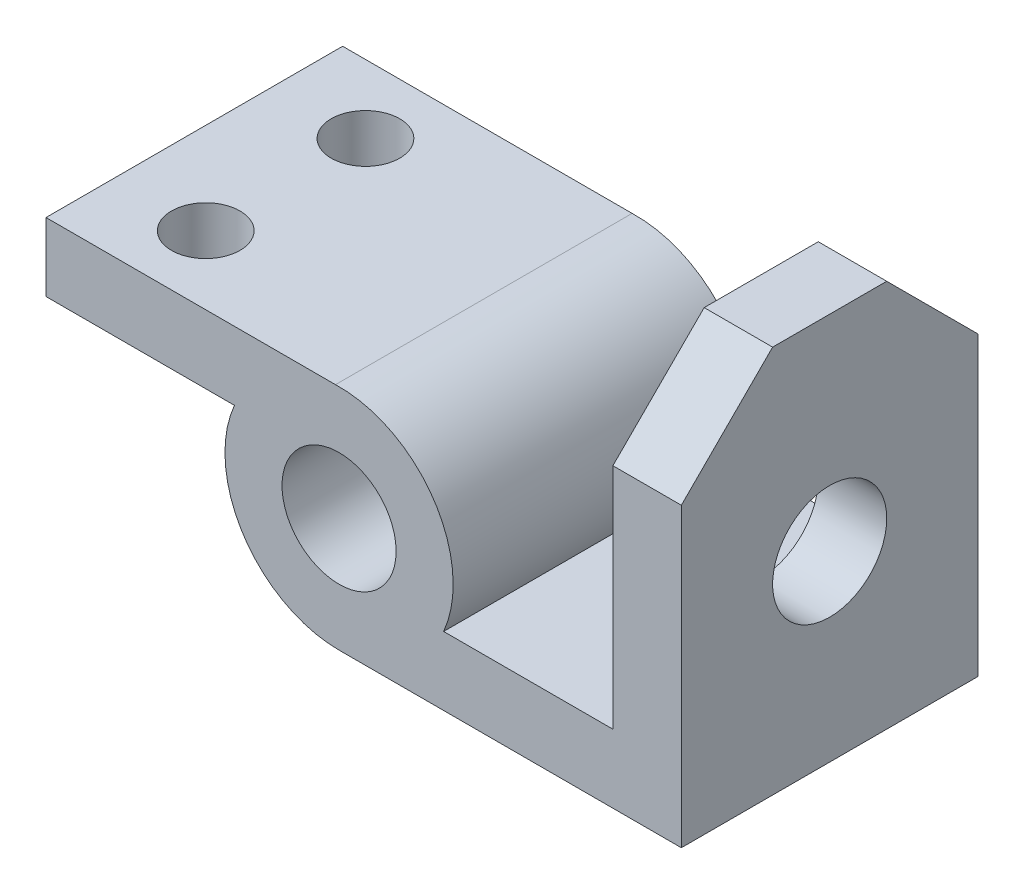
ISO-10303-21;
HEADER;
FILE_DESCRIPTION(('STEP AP214'),'2;1');
FILE_NAME('part.step','',(''),(''),'','','');
FILE_SCHEMA(('AUTOMOTIVE_DESIGN { 1 0 10303 214 1 1 1 1 }'));
ENDSEC;
DATA;
#1=APPLICATION_CONTEXT('core data for automotive mechanical design processes');
#2=APPLICATION_PROTOCOL_DEFINITION('international standard','automotive_design',2000,#1);
#3=PRODUCT_CONTEXT('',#1,'mechanical');
#4=PRODUCT('Part','Part','',(#3));
#5=PRODUCT_RELATED_PRODUCT_CATEGORY('part','',(#4));
#6=PRODUCT_DEFINITION_FORMATION('','',#4);
#7=PRODUCT_DEFINITION_CONTEXT('part definition',#1,'design');
#8=PRODUCT_DEFINITION('design','',#6,#7);
#9=PRODUCT_DEFINITION_SHAPE('','',#8);
#10=(LENGTH_UNIT() NAMED_UNIT(*) SI_UNIT(.MILLI.,.METRE.));
#11=(NAMED_UNIT(*) PLANE_ANGLE_UNIT() SI_UNIT($,.RADIAN.));
#12=(NAMED_UNIT(*) SI_UNIT($,.STERADIAN.) SOLID_ANGLE_UNIT());
#13=UNCERTAINTY_MEASURE_WITH_UNIT(LENGTH_MEASURE(1.E-05),#10,'distance_accuracy_value','');
#14=(GEOMETRIC_REPRESENTATION_CONTEXT(3) GLOBAL_UNCERTAINTY_ASSIGNED_CONTEXT((#13)) GLOBAL_UNIT_ASSIGNED_CONTEXT((#10,
#11,#12)) REPRESENTATION_CONTEXT('',''));
#15=CARTESIAN_POINT('',(0.,0.,0.));
#16=DIRECTION('',(0.,0.,1.));
#17=DIRECTION('',(1.,0.,0.));
#18=AXIS2_PLACEMENT_3D('',#15,#16,#17);
#19=CARTESIAN_POINT('',(95.25,-12.7,-82.55));
#20=DIRECTION('',(0.,1.,0.));
#21=DIRECTION('',(-1.,0.,0.));
#22=AXIS2_PLACEMENT_3D('',#19,#20,#21);
#23=PLANE('',#22);
#24=DIRECTION('',(-1.,0.,0.));
#25=VECTOR('',#24,1.);
#26=CARTESIAN_POINT('',(95.25,-12.7,0.));
#27=LINE('',#26,#25);
#28=CARTESIAN_POINT('',(76.2,-12.7,0.));
#29=VERTEX_POINT('',#28);
#30=CARTESIAN_POINT('',(29.0993556629696,-12.7,0.));
#31=VERTEX_POINT('',#30);
#32=EDGE_CURVE('E156',#29,#31,#27,.T.);
#33=ORIENTED_EDGE('',*,*,#32,.F.);
#34=DIRECTION('',(0.,0.,1.));
#35=VECTOR('',#34,1.);
#36=CARTESIAN_POINT('',(76.2,-12.7,-82.55));
#37=LINE('',#36,#35);
#38=CARTESIAN_POINT('',(76.2,-12.7,-82.55));
#39=VERTEX_POINT('',#38);
#40=EDGE_CURVE('E144',#39,#29,#37,.T.);
#41=ORIENTED_EDGE('',*,*,#40,.F.);
#42=DIRECTION('',(-1.,0.,0.));
#43=VECTOR('',#42,1.);
#44=CARTESIAN_POINT('',(95.25,-12.7,-82.55));
#45=LINE('',#44,#43);
#46=CARTESIAN_POINT('',(29.0993556629696,-12.7,-82.55));
#47=VERTEX_POINT('',#46);
#48=EDGE_CURVE('E154',#39,#47,#45,.T.);
#49=ORIENTED_EDGE('',*,*,#48,.T.);
#50=DIRECTION('',(0.,0.,1.));
#51=VECTOR('',#50,1.);
#52=CARTESIAN_POINT('',(29.0993556629696,-12.7,-82.55));
#53=LINE('',#52,#51);
#54=EDGE_CURVE('E327',#47,#31,#53,.T.);
#55=ORIENTED_EDGE('',*,*,#54,.T.);
#56=EDGE_LOOP('',(#33,#41,#49,#55));
#57=FACE_BOUND('',#56,.T.);
#58=ADVANCED_FACE('F47',(#57),#23,.T.);
#59=CARTESIAN_POINT('',(0.,0.,-82.55));
#60=DIRECTION('',(0.,0.,1.));
#61=DIRECTION('',(1.,0.,0.));
#62=AXIS2_PLACEMENT_3D('',#59,#60,#61);
#63=CYLINDRICAL_SURFACE('',#62,31.75);
#64=ORIENTED_EDGE('',*,*,#54,.F.);
#65=CARTESIAN_POINT('',(0.,0.,-82.55));
#66=DIRECTION('',(0.,0.,1.));
#67=DIRECTION('',(1.,0.,0.));
#68=AXIS2_PLACEMENT_3D('',#65,#66,#67);
#69=CIRCLE('',#68,31.75);
#70=CARTESIAN_POINT('',(-0.997093543872898,31.7343395151808,-82.55));
#71=VERTEX_POINT('',#70);
#72=EDGE_CURVE('E165',#47,#71,#69,.T.);
#73=ORIENTED_EDGE('',*,*,#72,.T.);
#74=DIRECTION('',(0.,0.,1.));
#75=VECTOR('',#74,1.);
#76=CARTESIAN_POINT('',(-0.997093543872898,31.7343395151808,-82.55));
#77=LINE('',#76,#75);
#78=CARTESIAN_POINT('',(-0.997093543872898,31.7343395151808,0.));
#79=VERTEX_POINT('',#78);
#80=EDGE_CURVE('E211',#79,#71,#77,.F.);
#81=ORIENTED_EDGE('',*,*,#80,.F.);
#82=CARTESIAN_POINT('',(0.,0.,0.));
#83=DIRECTION('',(0.,0.,1.));
#84=DIRECTION('',(1.,0.,0.));
#85=AXIS2_PLACEMENT_3D('',#82,#83,#84);
#86=CIRCLE('',#85,31.75);
#87=EDGE_CURVE('E226',#31,#79,#86,.T.);
#88=ORIENTED_EDGE('',*,*,#87,.F.);
#89=EDGE_LOOP('',(#64,#73,#81,#88));
#90=FACE_BOUND('',#89,.T.);
#91=ADVANCED_FACE('F279',(#90),#63,.T.);
#92=DIRECTION('',(0.,0.,1.));
#93=VECTOR('',#92,1.);
#94=CARTESIAN_POINT('',(0.,-31.75,-82.55));
#95=LINE('',#94,#93);
#96=CARTESIAN_POINT('',(0.,-31.75,-82.55));
#97=VERTEX_POINT('',#96);
#98=CARTESIAN_POINT('',(0.,-31.75,0.));
#99=VERTEX_POINT('',#98);
#100=EDGE_CURVE('E168',#97,#99,#95,.T.);
#101=ORIENTED_EDGE('',*,*,#100,.T.);
#102=CARTESIAN_POINT('',(-29.1061854433662,12.6843395151808,0.));
#103=VERTEX_POINT('',#102);
#104=EDGE_CURVE('E235',#103,#99,#86,.T.);
#105=ORIENTED_EDGE('',*,*,#104,.F.);
#106=DIRECTION('',(0.,0.,1.));
#107=VECTOR('',#106,1.);
#108=CARTESIAN_POINT('',(-29.1061854433662,12.6843395151808,-82.55));
#109=LINE('',#108,#107);
#110=CARTESIAN_POINT('',(-29.1061854433662,12.6843395151808,-82.55));
#111=VERTEX_POINT('',#110);
#112=EDGE_CURVE('E207',#111,#103,#109,.T.);
#113=ORIENTED_EDGE('',*,*,#112,.F.);
#114=EDGE_CURVE('E230',#111,#97,#69,.T.);
#115=ORIENTED_EDGE('',*,*,#114,.T.);
#116=EDGE_LOOP('',(#101,#105,#113,#115));
#117=FACE_BOUND('',#116,.T.);
#118=ADVANCED_FACE('F286',(#117),#63,.T.);
#119=CARTESIAN_POINT('',(0.,0.,-82.55));
#120=DIRECTION('',(0.,0.,1.));
#121=DIRECTION('',(1.,0.,0.));
#122=AXIS2_PLACEMENT_3D('',#119,#120,#121);
#123=PLANE('',#122);
#124=DIRECTION('',(0.,-1.,0.));
#125=VECTOR('',#124,1.);
#126=CARTESIAN_POINT('',(76.2,76.2,-82.55));
#127=LINE('',#126,#125);
#128=CARTESIAN_POINT('',(76.2,50.7999999999999,-82.55));
#129=VERTEX_POINT('',#128);
#130=EDGE_CURVE('E139',#129,#39,#127,.T.);
#131=ORIENTED_EDGE('',*,*,#130,.F.);
#132=DIRECTION('',(1.,0.,0.));
#133=VECTOR('',#132,1.);
#134=CARTESIAN_POINT('',(0.,50.7999999999999,-82.55));
#135=LINE('',#134,#133);
#136=CARTESIAN_POINT('',(95.25,50.7999999999998,-82.55));
#137=VERTEX_POINT('',#136);
#138=EDGE_CURVE('E72',#129,#137,#135,.T.);
#139=ORIENTED_EDGE('',*,*,#138,.T.);
#140=DIRECTION('',(0.,1.,0.));
#141=VECTOR('',#140,1.);
#142=CARTESIAN_POINT('',(95.25,-31.75,-82.55));
#143=LINE('',#142,#141);
#144=CARTESIAN_POINT('',(95.25,-31.75,-82.55));
#145=VERTEX_POINT('',#144);
#146=EDGE_CURVE('E167',#145,#137,#143,.T.);
#147=ORIENTED_EDGE('',*,*,#146,.F.);
#148=DIRECTION('',(1.,0.,0.));
#149=VECTOR('',#148,1.);
#150=CARTESIAN_POINT('',(0.,-31.75,-82.55));
#151=LINE('',#150,#149);
#152=EDGE_CURVE('E172',#97,#145,#151,.T.);
#153=ORIENTED_EDGE('',*,*,#152,.F.);
#154=ORIENTED_EDGE('',*,*,#114,.F.);
#155=DIRECTION('',(1.,0.,0.));
#156=VECTOR('',#155,1.);
#157=CARTESIAN_POINT('',(-29.1061854433662,12.6843395151808,-82.55));
#158=LINE('',#157,#156);
#159=CARTESIAN_POINT('',(-81.5529064561271,12.6843395151808,-82.55));
#160=VERTEX_POINT('',#159);
#161=EDGE_CURVE('E192',#160,#111,#158,.T.);
#162=ORIENTED_EDGE('',*,*,#161,.F.);
#163=DIRECTION('',(0.,-1.,0.));
#164=VECTOR('',#163,1.);
#165=CARTESIAN_POINT('',(-81.5529064561271,31.7343395151808,-82.55));
#166=LINE('',#165,#164);
#167=CARTESIAN_POINT('',(-81.5529064561271,31.7343395151808,-82.55));
#168=VERTEX_POINT('',#167);
#169=EDGE_CURVE('E187',#168,#160,#166,.T.);
#170=ORIENTED_EDGE('',*,*,#169,.F.);
#171=DIRECTION('',(-1.,0.,0.));
#172=VECTOR('',#171,1.);
#173=CARTESIAN_POINT('',(0.997093543872919,31.7343395151808,-82.55));
#174=LINE('',#173,#172);
#175=EDGE_CURVE('E184',#71,#168,#174,.T.);
#176=ORIENTED_EDGE('',*,*,#175,.F.);
#177=ORIENTED_EDGE('',*,*,#72,.F.);
#178=ORIENTED_EDGE('',*,*,#48,.F.);
#179=EDGE_LOOP('',(#131,#139,#147,#153,#154,#162,#170,#176,#177,#178));
#180=FACE_BOUND('',#179,.T.);
#181=CARTESIAN_POINT('',(0.,0.,-82.55));
#182=DIRECTION('',(0.,0.,1.));
#183=DIRECTION('',(1.,0.,0.));
#184=AXIS2_PLACEMENT_3D('',#181,#182,#183);
#185=CIRCLE('',#184,15.875);
#186=CARTESIAN_POINT('',(15.875,0.,-82.55));
#187=VERTEX_POINT('',#186);
#188=EDGE_CURVE('E222',#187,#187,#185,.T.);
#189=ORIENTED_EDGE('',*,*,#188,.T.);
#190=EDGE_LOOP('',(#189));
#191=FACE_BOUND('',#190,.T.);
#192=ADVANCED_FACE('F162',(#180,#191),#123,.F.);
#193=CARTESIAN_POINT('',(0.,0.,0.));
#194=DIRECTION('',(0.,0.,1.));
#195=DIRECTION('',(1.,0.,0.));
#196=AXIS2_PLACEMENT_3D('',#193,#194,#195);
#197=PLANE('',#196);
#198=DIRECTION('',(0.,1.,0.));
#199=VECTOR('',#198,1.);
#200=CARTESIAN_POINT('',(95.25,-31.75,0.));
#201=LINE('',#200,#199);
#202=CARTESIAN_POINT('',(95.25,-31.75,0.));
#203=VERTEX_POINT('',#202);
#204=CARTESIAN_POINT('',(95.25,50.7999999999999,0.));
#205=VERTEX_POINT('',#204);
#206=EDGE_CURVE('E329',#203,#205,#201,.T.);
#207=ORIENTED_EDGE('',*,*,#206,.T.);
#208=DIRECTION('',(-1.,0.,0.));
#209=VECTOR('',#208,1.);
#210=CARTESIAN_POINT('',(76.2,50.7999999999999,0.));
#211=LINE('',#210,#209);
#212=CARTESIAN_POINT('',(76.2,50.7999999999999,0.));
#213=VERTEX_POINT('',#212);
#214=EDGE_CURVE('E11',#205,#213,#211,.T.);
#215=ORIENTED_EDGE('',*,*,#214,.T.);
#216=DIRECTION('',(0.,-1.,0.));
#217=VECTOR('',#216,1.);
#218=CARTESIAN_POINT('',(76.2,76.2,0.));
#219=LINE('',#218,#217);
#220=EDGE_CURVE('E150',#213,#29,#219,.T.);
#221=ORIENTED_EDGE('',*,*,#220,.T.);
#222=ORIENTED_EDGE('',*,*,#32,.T.);
#223=ORIENTED_EDGE('',*,*,#87,.T.);
#224=DIRECTION('',(-1.,0.,0.));
#225=VECTOR('',#224,1.);
#226=CARTESIAN_POINT('',(0.997093543872919,31.7343395151808,0.));
#227=LINE('',#226,#225);
#228=CARTESIAN_POINT('',(-81.5529064561271,31.7343395151808,0.));
#229=VERTEX_POINT('',#228);
#230=EDGE_CURVE('E197',#79,#229,#227,.T.);
#231=ORIENTED_EDGE('',*,*,#230,.T.);
#232=DIRECTION('',(0.,-1.,0.));
#233=VECTOR('',#232,1.);
#234=CARTESIAN_POINT('',(-81.5529064561271,31.7343395151808,0.));
#235=LINE('',#234,#233);
#236=CARTESIAN_POINT('',(-81.5529064561271,12.6843395151808,0.));
#237=VERTEX_POINT('',#236);
#238=EDGE_CURVE('E200',#229,#237,#235,.T.);
#239=ORIENTED_EDGE('',*,*,#238,.T.);
#240=DIRECTION('',(1.,0.,0.));
#241=VECTOR('',#240,1.);
#242=CARTESIAN_POINT('',(-29.1061854433662,12.6843395151808,0.));
#243=LINE('',#242,#241);
#244=EDGE_CURVE('E188',#237,#103,#243,.T.);
#245=ORIENTED_EDGE('',*,*,#244,.T.);
#246=ORIENTED_EDGE('',*,*,#104,.T.);
#247=DIRECTION('',(1.,0.,0.));
#248=VECTOR('',#247,1.);
#249=CARTESIAN_POINT('',(0.,-31.75,0.));
#250=LINE('',#249,#248);
#251=EDGE_CURVE('E178',#99,#203,#250,.T.);
#252=ORIENTED_EDGE('',*,*,#251,.T.);
#253=EDGE_LOOP('',(#207,#215,#221,#222,#223,#231,#239,#245,#246,#252));
#254=FACE_BOUND('',#253,.T.);
#255=CARTESIAN_POINT('',(0.,0.,0.));
#256=DIRECTION('',(0.,0.,1.));
#257=DIRECTION('',(1.,0.,0.));
#258=AXIS2_PLACEMENT_3D('',#255,#256,#257);
#259=CIRCLE('',#258,15.875);
#260=CARTESIAN_POINT('',(15.875,0.,0.));
#261=VERTEX_POINT('',#260);
#262=EDGE_CURVE('E221',#261,#261,#259,.T.);
#263=ORIENTED_EDGE('',*,*,#262,.F.);
#264=EDGE_LOOP('',(#263));
#265=FACE_BOUND('',#264,.T.);
#266=ADVANCED_FACE('F306',(#254,#265),#197,.T.);
#267=CARTESIAN_POINT('',(0.,0.,-82.55));
#268=DIRECTION('',(0.,0.,1.));
#269=DIRECTION('',(1.,0.,0.));
#270=AXIS2_PLACEMENT_3D('',#267,#268,#269);
#271=CYLINDRICAL_SURFACE('',#270,15.875);
#272=ORIENTED_EDGE('',*,*,#188,.F.);
#273=EDGE_LOOP('',(#272));
#274=FACE_BOUND('',#273,.T.);
#275=ORIENTED_EDGE('',*,*,#262,.T.);
#276=EDGE_LOOP('',(#275));
#277=FACE_BOUND('',#276,.T.);
#278=ADVANCED_FACE('F295',(#274,#277),#271,.F.);
#279=CARTESIAN_POINT('',(-29.1061854433662,12.6843395151808,-82.55));
#280=DIRECTION('',(0.,-1.,0.));
#281=DIRECTION('',(1.,0.,0.));
#282=AXIS2_PLACEMENT_3D('',#279,#280,#281);
#283=PLANE('',#282);
#284=CARTESIAN_POINT('',(-56.1529064561271,12.6843395151808,-63.5));
#285=DIRECTION('',(0.,-1.,0.));
#286=DIRECTION('',(1.,0.,0.));
#287=AXIS2_PLACEMENT_3D('',#284,#285,#286);
#288=CIRCLE('',#287,9.52500000000002);
#289=CARTESIAN_POINT('',(-46.6279064561271,12.6843395151808,-63.5));
#290=VERTEX_POINT('',#289);
#291=EDGE_CURVE('E337',#290,#290,#288,.T.);
#292=ORIENTED_EDGE('',*,*,#291,.F.);
#293=EDGE_LOOP('',(#292));
#294=FACE_BOUND('',#293,.T.);
#295=CARTESIAN_POINT('',(-56.1529064561271,12.6843395151808,-19.05));
#296=DIRECTION('',(0.,-1.,0.));
#297=DIRECTION('',(1.,0.,0.));
#298=AXIS2_PLACEMENT_3D('',#295,#296,#297);
#299=CIRCLE('',#298,9.525);
#300=CARTESIAN_POINT('',(-46.6279064561271,12.6843395151808,-19.05));
#301=VERTEX_POINT('',#300);
#302=EDGE_CURVE('E342',#301,#301,#299,.T.);
#303=ORIENTED_EDGE('',*,*,#302,.F.);
#304=EDGE_LOOP('',(#303));
#305=FACE_BOUND('',#304,.T.);
#306=ORIENTED_EDGE('',*,*,#244,.F.);
#307=DIRECTION('',(0.,0.,1.));
#308=VECTOR('',#307,1.);
#309=CARTESIAN_POINT('',(-81.5529064561271,12.6843395151808,-82.55));
#310=LINE('',#309,#308);
#311=EDGE_CURVE('E212',#160,#237,#310,.T.);
#312=ORIENTED_EDGE('',*,*,#311,.F.);
#313=ORIENTED_EDGE('',*,*,#161,.T.);
#314=ORIENTED_EDGE('',*,*,#112,.T.);
#315=EDGE_LOOP('',(#306,#312,#313,#314));
#316=FACE_BOUND('',#315,.T.);
#317=ADVANCED_FACE('F291',(#294,#305,#316),#283,.T.);
#318=CARTESIAN_POINT('',(-81.5529064561271,31.7343395151808,-82.55));
#319=DIRECTION('',(-1.,0.,0.));
#320=DIRECTION('',(0.,0.,1.));
#321=AXIS2_PLACEMENT_3D('',#318,#319,#320);
#322=PLANE('',#321);
#323=ORIENTED_EDGE('',*,*,#238,.F.);
#324=DIRECTION('',(0.,0.,1.));
#325=VECTOR('',#324,1.);
#326=CARTESIAN_POINT('',(-81.5529064561271,31.7343395151808,-82.55));
#327=LINE('',#326,#325);
#328=EDGE_CURVE('E196',#168,#229,#327,.T.);
#329=ORIENTED_EDGE('',*,*,#328,.F.);
#330=ORIENTED_EDGE('',*,*,#169,.T.);
#331=ORIENTED_EDGE('',*,*,#311,.T.);
#332=EDGE_LOOP('',(#323,#329,#330,#331));
#333=FACE_BOUND('',#332,.T.);
#334=ADVANCED_FACE('F294',(#333),#322,.T.);
#335=CARTESIAN_POINT('',(0.997093543872919,31.7343395151808,-82.55));
#336=DIRECTION('',(0.,1.,0.));
#337=DIRECTION('',(-1.,0.,0.));
#338=AXIS2_PLACEMENT_3D('',#335,#336,#337);
#339=PLANE('',#338);
#340=CARTESIAN_POINT('',(-56.1529064561271,31.7343395151808,-63.5));
#341=DIRECTION('',(0.,1.,0.));
#342=DIRECTION('',(-1.,0.,0.));
#343=AXIS2_PLACEMENT_3D('',#340,#341,#342);
#344=CIRCLE('',#343,9.52500000000002);
#345=CARTESIAN_POINT('',(-65.6779064561271,31.7343395151808,-63.5));
#346=VERTEX_POINT('',#345);
#347=EDGE_CURVE('E346',#346,#346,#344,.T.);
#348=ORIENTED_EDGE('',*,*,#347,.F.);
#349=EDGE_LOOP('',(#348));
#350=FACE_BOUND('',#349,.T.);
#351=CARTESIAN_POINT('',(-56.1529064561271,31.7343395151808,-19.05));
#352=DIRECTION('',(0.,1.,0.));
#353=DIRECTION('',(-1.,0.,0.));
#354=AXIS2_PLACEMENT_3D('',#351,#352,#353);
#355=CIRCLE('',#354,9.525);
#356=CARTESIAN_POINT('',(-65.6779064561271,31.7343395151808,-19.05));
#357=VERTEX_POINT('',#356);
#358=EDGE_CURVE('E149',#357,#357,#355,.T.);
#359=ORIENTED_EDGE('',*,*,#358,.F.);
#360=EDGE_LOOP('',(#359));
#361=FACE_BOUND('',#360,.T.);
#362=ORIENTED_EDGE('',*,*,#230,.F.);
#363=ORIENTED_EDGE('',*,*,#80,.T.);
#364=ORIENTED_EDGE('',*,*,#175,.T.);
#365=ORIENTED_EDGE('',*,*,#328,.T.);
#366=EDGE_LOOP('',(#362,#363,#364,#365));
#367=FACE_BOUND('',#366,.T.);
#368=ADVANCED_FACE('F299',(#350,#361,#367),#339,.T.);
#369=CARTESIAN_POINT('',(95.25,-31.75,-82.55));
#370=DIRECTION('',(1.,0.,0.));
#371=DIRECTION('',(0.,0.,-1.));
#372=AXIS2_PLACEMENT_3D('',#369,#370,#371);
#373=PLANE('',#372);
#374=CARTESIAN_POINT('',(95.25,19.05,-41.275));
#375=DIRECTION('',(1.,0.,0.));
#376=DIRECTION('',(0.,0.,-1.));
#377=AXIS2_PLACEMENT_3D('',#374,#375,#376);
#378=CIRCLE('',#377,15.875);
#379=CARTESIAN_POINT('',(95.25,19.05,-57.15));
#380=VERTEX_POINT('',#379);
#381=EDGE_CURVE('E357',#380,#380,#378,.T.);
#382=ORIENTED_EDGE('',*,*,#381,.F.);
#383=EDGE_LOOP('',(#382));
#384=FACE_BOUND('',#383,.T.);
#385=ORIENTED_EDGE('',*,*,#146,.T.);
#386=DIRECTION('',(0.,-0.707106781186548,-0.707106781186548));
#387=VECTOR('',#386,1.);
#388=CARTESIAN_POINT('',(95.25,9.52499999999993,-123.825));
#389=LINE('',#388,#387);
#390=CARTESIAN_POINT('',(95.25,76.2,-57.1499999999999));
#391=VERTEX_POINT('',#390);
#392=EDGE_CURVE('E57',#137,#391,#389,.F.);
#393=ORIENTED_EDGE('',*,*,#392,.T.);
#394=DIRECTION('',(0.,0.,-1.));
#395=VECTOR('',#394,1.);
#396=CARTESIAN_POINT('',(95.25,76.2,-82.55));
#397=LINE('',#396,#395);
#398=CARTESIAN_POINT('',(95.25,76.2,-25.4000000000001));
#399=VERTEX_POINT('',#398);
#400=EDGE_CURVE('E158',#399,#391,#397,.T.);
#401=ORIENTED_EDGE('',*,*,#400,.F.);
#402=DIRECTION('',(0.,-0.707106781186548,0.707106781186548));
#403=VECTOR('',#402,1.);
#404=CARTESIAN_POINT('',(95.25,50.7999999999999,0.));
#405=LINE('',#404,#403);
#406=EDGE_CURVE('E64',#399,#205,#405,.T.);
#407=ORIENTED_EDGE('',*,*,#406,.T.);
#408=ORIENTED_EDGE('',*,*,#206,.F.);
#409=DIRECTION('',(0.,0.,1.));
#410=VECTOR('',#409,1.);
#411=CARTESIAN_POINT('',(95.25,-31.75,-82.55));
#412=LINE('',#411,#410);
#413=EDGE_CURVE('E175',#145,#203,#412,.T.);
#414=ORIENTED_EDGE('',*,*,#413,.F.);
#415=EDGE_LOOP('',(#385,#393,#401,#407,#408,#414));
#416=FACE_BOUND('',#415,.T.);
#417=ADVANCED_FACE('F257',(#384,#416),#373,.T.);
#418=CARTESIAN_POINT('',(0.,-31.75,-82.55));
#419=DIRECTION('',(0.,-1.,0.));
#420=DIRECTION('',(0.,0.,-1.));
#421=AXIS2_PLACEMENT_3D('',#418,#419,#420);
#422=PLANE('',#421);
#423=ORIENTED_EDGE('',*,*,#251,.F.);
#424=ORIENTED_EDGE('',*,*,#100,.F.);
#425=ORIENTED_EDGE('',*,*,#152,.T.);
#426=ORIENTED_EDGE('',*,*,#413,.T.);
#427=EDGE_LOOP('',(#423,#424,#425,#426));
#428=FACE_BOUND('',#427,.T.);
#429=ADVANCED_FACE('F325',(#428),#422,.T.);
#430=CARTESIAN_POINT('',(-56.1529064561271,-50.8156604848192,-19.05));
#431=DIRECTION('',(0.,1.,0.));
#432=DIRECTION('',(-1.,0.,0.));
#433=AXIS2_PLACEMENT_3D('',#430,#431,#432);
#434=CYLINDRICAL_SURFACE('',#433,9.525);
#435=ORIENTED_EDGE('',*,*,#302,.T.);
#436=EDGE_LOOP('',(#435));
#437=FACE_BOUND('',#436,.T.);
#438=ORIENTED_EDGE('',*,*,#358,.T.);
#439=EDGE_LOOP('',(#438));
#440=FACE_BOUND('',#439,.T.);
#441=ADVANCED_FACE('F373',(#437,#440),#434,.F.);
#442=CARTESIAN_POINT('',(-56.1529064561271,-50.8156604848192,-63.5));
#443=DIRECTION('',(0.,1.,0.));
#444=DIRECTION('',(-1.,0.,0.));
#445=AXIS2_PLACEMENT_3D('',#442,#443,#444);
#446=CYLINDRICAL_SURFACE('',#445,9.52500000000002);
#447=ORIENTED_EDGE('',*,*,#291,.T.);
#448=EDGE_LOOP('',(#447));
#449=FACE_BOUND('',#448,.T.);
#450=ORIENTED_EDGE('',*,*,#347,.T.);
#451=EDGE_LOOP('',(#450));
#452=FACE_BOUND('',#451,.T.);
#453=ADVANCED_FACE('F367',(#449,#452),#446,.F.);
#454=CARTESIAN_POINT('',(76.2,76.2,-82.55));
#455=DIRECTION('',(1.,0.,0.));
#456=DIRECTION('',(0.,0.,-1.));
#457=AXIS2_PLACEMENT_3D('',#454,#455,#456);
#458=PLANE('',#457);
#459=CARTESIAN_POINT('',(76.2,19.05,-41.275));
#460=DIRECTION('',(1.,0.,0.));
#461=DIRECTION('',(0.,0.,-1.));
#462=AXIS2_PLACEMENT_3D('',#459,#460,#461);
#463=CIRCLE('',#462,15.875);
#464=CARTESIAN_POINT('',(76.2,19.05,-57.15));
#465=VERTEX_POINT('',#464);
#466=EDGE_CURVE('E159',#465,#465,#463,.F.);
#467=ORIENTED_EDGE('',*,*,#466,.F.);
#468=EDGE_LOOP('',(#467));
#469=FACE_BOUND('',#468,.T.);
#470=DIRECTION('',(0.,0.,1.));
#471=VECTOR('',#470,1.);
#472=CARTESIAN_POINT('',(76.2,76.2,-82.55));
#473=LINE('',#472,#471);
#474=CARTESIAN_POINT('',(76.2,76.2,-57.1499999999999));
#475=VERTEX_POINT('',#474);
#476=CARTESIAN_POINT('',(76.2,76.2,-25.4000000000001));
#477=VERTEX_POINT('',#476);
#478=EDGE_CURVE('E265',#475,#477,#473,.T.);
#479=ORIENTED_EDGE('',*,*,#478,.F.);
#480=DIRECTION('',(0.,0.707106781186548,0.707106781186548));
#481=VECTOR('',#480,1.);
#482=CARTESIAN_POINT('',(76.2,76.2,-57.1499999999999));
#483=LINE('',#482,#481);
#484=EDGE_CURVE('E146',#475,#129,#483,.F.);
#485=ORIENTED_EDGE('',*,*,#484,.T.);
#486=ORIENTED_EDGE('',*,*,#130,.T.);
#487=ORIENTED_EDGE('',*,*,#40,.T.);
#488=ORIENTED_EDGE('',*,*,#220,.F.);
#489=DIRECTION('',(0.,0.707106781186548,-0.707106781186548));
#490=VECTOR('',#489,1.);
#491=CARTESIAN_POINT('',(76.2,76.2,-25.4000000000001));
#492=LINE('',#491,#490);
#493=EDGE_CURVE('E246',#213,#477,#492,.T.);
#494=ORIENTED_EDGE('',*,*,#493,.T.);
#495=EDGE_LOOP('',(#479,#485,#486,#487,#488,#494));
#496=FACE_BOUND('',#495,.T.);
#497=ADVANCED_FACE('F142',(#469,#496),#458,.F.);
#498=CARTESIAN_POINT('',(0.,76.2,0.));
#499=DIRECTION('',(0.,-1.,0.));
#500=DIRECTION('',(1.,0.,0.));
#501=AXIS2_PLACEMENT_3D('',#498,#499,#500);
#502=PLANE('',#501);
#503=ORIENTED_EDGE('',*,*,#400,.T.);
#504=DIRECTION('',(-1.,0.,0.));
#505=VECTOR('',#504,1.);
#506=CARTESIAN_POINT('',(0.,76.2,-57.1499999999999));
#507=LINE('',#506,#505);
#508=EDGE_CURVE('E242',#391,#475,#507,.T.);
#509=ORIENTED_EDGE('',*,*,#508,.T.);
#510=ORIENTED_EDGE('',*,*,#478,.T.);
#511=DIRECTION('',(1.,0.,0.));
#512=VECTOR('',#511,1.);
#513=CARTESIAN_POINT('',(95.25,76.2,-25.4000000000001));
#514=LINE('',#513,#512);
#515=EDGE_CURVE('E234',#477,#399,#514,.T.);
#516=ORIENTED_EDGE('',*,*,#515,.T.);
#517=EDGE_LOOP('',(#503,#509,#510,#516));
#518=FACE_BOUND('',#517,.T.);
#519=ADVANCED_FACE('F261',(#518),#502,.F.);
#520=CARTESIAN_POINT('',(0.,76.2,-57.1499999999999));
#521=DIRECTION('',(0.,-0.707106781186548,0.707106781186548));
#522=DIRECTION('',(-1.,0.,0.));
#523=AXIS2_PLACEMENT_3D('',#520,#521,#522);
#524=PLANE('',#523);
#525=ORIENTED_EDGE('',*,*,#392,.F.);
#526=ORIENTED_EDGE('',*,*,#138,.F.);
#527=ORIENTED_EDGE('',*,*,#484,.F.);
#528=ORIENTED_EDGE('',*,*,#508,.F.);
#529=EDGE_LOOP('',(#525,#526,#527,#528));
#530=FACE_BOUND('',#529,.T.);
#531=ADVANCED_FACE('F267',(#530),#524,.F.);
#532=CARTESIAN_POINT('',(0.,76.2,-25.4000000000001));
#533=DIRECTION('',(0.,0.707106781186548,0.707106781186548));
#534=DIRECTION('',(-1.,0.,0.));
#535=AXIS2_PLACEMENT_3D('',#532,#533,#534);
#536=PLANE('',#535);
#537=ORIENTED_EDGE('',*,*,#493,.F.);
#538=ORIENTED_EDGE('',*,*,#214,.F.);
#539=ORIENTED_EDGE('',*,*,#406,.F.);
#540=ORIENTED_EDGE('',*,*,#515,.F.);
#541=EDGE_LOOP('',(#537,#538,#539,#540));
#542=FACE_BOUND('',#541,.T.);
#543=ADVANCED_FACE('F50',(#542),#536,.T.);
#544=CARTESIAN_POINT('',(-81.5539064561271,19.05,-41.275));
#545=DIRECTION('',(1.,0.,0.));
#546=DIRECTION('',(0.,0.,-1.));
#547=AXIS2_PLACEMENT_3D('',#544,#545,#546);
#548=CYLINDRICAL_SURFACE('',#547,15.875);
#549=ORIENTED_EDGE('',*,*,#381,.T.);
#550=EDGE_LOOP('',(#549));
#551=FACE_BOUND('',#550,.T.);
#552=ORIENTED_EDGE('',*,*,#466,.T.);
#553=EDGE_LOOP('',(#552));
#554=FACE_BOUND('',#553,.T.);
#555=ADVANCED_FACE('F273',(#551,#554),#548,.F.);
#556=CLOSED_SHELL('',(#58,#91,#118,#192,#266,#278,#317,#334,#368,#417,#429,#441,#453,#497,#519,
#531,#543,#555));
#557=MANIFOLD_SOLID_BREP('B2',#556);
#558=ADVANCED_BREP_SHAPE_REPRESENTATION('',(#18,#557),#14);
#559=SHAPE_DEFINITION_REPRESENTATION(#9,#558);
ENDSEC;
END-ISO-10303-21;
